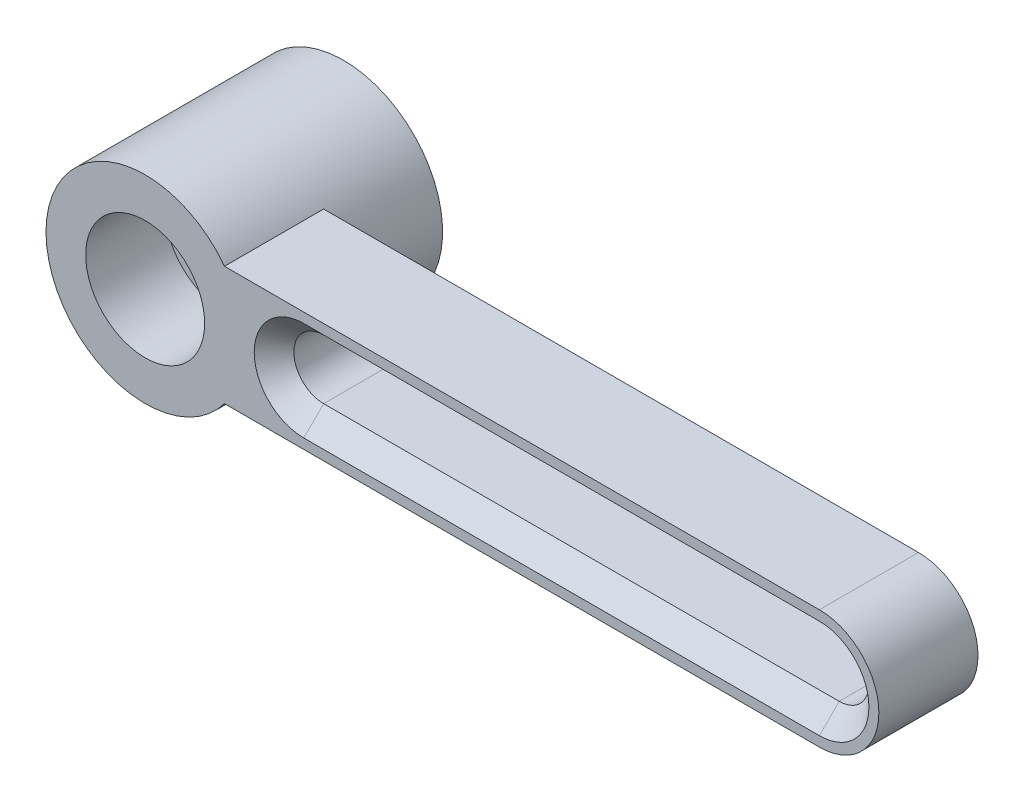
ISO-10303-21;
HEADER;
FILE_DESCRIPTION(('STEP AP214'),'2;1');
FILE_NAME('part.step','',(''),(''),'','','');
FILE_SCHEMA(('AUTOMOTIVE_DESIGN { 1 0 10303 214 1 1 1 1 }'));
ENDSEC;
DATA;
#1=APPLICATION_CONTEXT('core data for automotive mechanical design processes');
#2=APPLICATION_PROTOCOL_DEFINITION('international standard','automotive_design',2000,#1);
#3=PRODUCT_CONTEXT('',#1,'mechanical');
#4=PRODUCT('Part','Part','',(#3));
#5=PRODUCT_RELATED_PRODUCT_CATEGORY('part','',(#4));
#6=PRODUCT_DEFINITION_FORMATION('','',#4);
#7=PRODUCT_DEFINITION_CONTEXT('part definition',#1,'design');
#8=PRODUCT_DEFINITION('design','',#6,#7);
#9=PRODUCT_DEFINITION_SHAPE('','',#8);
#10=(LENGTH_UNIT() NAMED_UNIT(*) SI_UNIT(.MILLI.,.METRE.));
#11=(NAMED_UNIT(*) PLANE_ANGLE_UNIT() SI_UNIT($,.RADIAN.));
#12=(NAMED_UNIT(*) SI_UNIT($,.STERADIAN.) SOLID_ANGLE_UNIT());
#13=UNCERTAINTY_MEASURE_WITH_UNIT(LENGTH_MEASURE(1.E-05),#10,'distance_accuracy_value','');
#14=(GEOMETRIC_REPRESENTATION_CONTEXT(3) GLOBAL_UNCERTAINTY_ASSIGNED_CONTEXT((#13)) GLOBAL_UNIT_ASSIGNED_CONTEXT((#10,
#11,#12)) REPRESENTATION_CONTEXT('',''));
#15=CARTESIAN_POINT('',(0.,0.,0.));
#16=DIRECTION('',(0.,0.,1.));
#17=DIRECTION('',(1.,0.,0.));
#18=AXIS2_PLACEMENT_3D('',#15,#16,#17);
#19=CARTESIAN_POINT('',(-17.,0.,-5.));
#20=DIRECTION('',(0.,0.,1.));
#21=DIRECTION('',(1.,0.,0.));
#22=AXIS2_PLACEMENT_3D('',#19,#20,#21);
#23=CYLINDRICAL_SURFACE('',#22,1.6);
#24=CARTESIAN_POINT('',(-17.,0.,-5.));
#25=DIRECTION('',(0.,0.,1.));
#26=DIRECTION('',(1.,0.,0.));
#27=AXIS2_PLACEMENT_3D('',#24,#25,#26);
#28=CIRCLE('',#27,1.6);
#29=CARTESIAN_POINT('',(-15.4,0.,-5.));
#30=VERTEX_POINT('',#29);
#31=EDGE_CURVE('E145',#30,#30,#28,.T.);
#32=ORIENTED_EDGE('',*,*,#31,.F.);
#33=EDGE_LOOP('',(#32));
#34=FACE_BOUND('',#33,.T.);
#35=CARTESIAN_POINT('',(-17.,0.,1.));
#36=DIRECTION('',(0.,0.,1.));
#37=DIRECTION('',(1.,0.,0.));
#38=AXIS2_PLACEMENT_3D('',#35,#36,#37);
#39=CIRCLE('',#38,1.6);
#40=CARTESIAN_POINT('',(-15.4,0.,1.));
#41=VERTEX_POINT('',#40);
#42=EDGE_CURVE('E41',#41,#41,#39,.F.);
#43=ORIENTED_EDGE('',*,*,#42,.F.);
#44=EDGE_LOOP('',(#43));
#45=FACE_BOUND('',#44,.T.);
#46=ADVANCED_FACE('F37',(#34,#45),#23,.F.);
#47=CARTESIAN_POINT('',(17.,0.,5.));
#48=DIRECTION('',(0.,0.,-1.));
#49=DIRECTION('',(-1.,0.,0.));
#50=AXIS2_PLACEMENT_3D('',#47,#48,#49);
#51=CYLINDRICAL_SURFACE('',#50,3.);
#52=DIRECTION('',(0.,0.,-1.));
#53=VECTOR('',#52,1.);
#54=CARTESIAN_POINT('',(17.,3.,5.));
#55=LINE('',#54,#53);
#56=CARTESIAN_POINT('',(17.,3.,5.));
#57=VERTEX_POINT('',#56);
#58=CARTESIAN_POINT('',(17.,3.,0.));
#59=VERTEX_POINT('',#58);
#60=EDGE_CURVE('E154',#57,#59,#55,.T.);
#61=ORIENTED_EDGE('',*,*,#60,.F.);
#62=CARTESIAN_POINT('',(17.,0.,5.));
#63=DIRECTION('',(0.,0.,1.));
#64=DIRECTION('',(1.,0.,0.));
#65=AXIS2_PLACEMENT_3D('',#62,#63,#64);
#66=CIRCLE('',#65,3.);
#67=CARTESIAN_POINT('',(17.,-3.,5.));
#68=VERTEX_POINT('',#67);
#69=EDGE_CURVE('E149',#68,#57,#66,.T.);
#70=ORIENTED_EDGE('',*,*,#69,.F.);
#71=DIRECTION('',(0.,0.,-1.));
#72=VECTOR('',#71,1.);
#73=CARTESIAN_POINT('',(17.,-3.,5.));
#74=LINE('',#73,#72);
#75=CARTESIAN_POINT('',(17.,-3.,0.));
#76=VERTEX_POINT('',#75);
#77=EDGE_CURVE('E164',#76,#68,#74,.F.);
#78=ORIENTED_EDGE('',*,*,#77,.F.);
#79=CARTESIAN_POINT('',(17.,0.,0.));
#80=DIRECTION('',(0.,0.,1.));
#81=DIRECTION('',(1.,0.,0.));
#82=AXIS2_PLACEMENT_3D('',#79,#80,#81);
#83=CIRCLE('',#82,3.);
#84=EDGE_CURVE('E168',#59,#76,#83,.F.);
#85=ORIENTED_EDGE('',*,*,#84,.F.);
#86=EDGE_LOOP('',(#61,#70,#78,#85));
#87=FACE_BOUND('',#86,.T.);
#88=ADVANCED_FACE('F239',(#87),#51,.T.);
#89=CARTESIAN_POINT('',(0.,0.,5.));
#90=DIRECTION('',(0.,0.,1.));
#91=DIRECTION('',(1.,0.,0.));
#92=AXIS2_PLACEMENT_3D('',#89,#90,#91);
#93=PLANE('',#92);
#94=CARTESIAN_POINT('',(-17.,0.,5.));
#95=DIRECTION('',(0.,0.,1.));
#96=DIRECTION('',(1.,0.,0.));
#97=AXIS2_PLACEMENT_3D('',#94,#95,#96);
#98=CIRCLE('',#97,3.);
#99=CARTESIAN_POINT('',(-14.,0.,5.));
#100=VERTEX_POINT('',#99);
#101=EDGE_CURVE('E422',#100,#100,#98,.T.);
#102=ORIENTED_EDGE('',*,*,#101,.F.);
#103=EDGE_LOOP('',(#102));
#104=FACE_BOUND('',#103,.T.);
#105=DIRECTION('',(-1.,0.,0.));
#106=VECTOR('',#105,1.);
#107=CARTESIAN_POINT('',(-20.,3.,5.));
#108=LINE('',#107,#106);
#109=CARTESIAN_POINT('',(-13.,3.,5.));
#110=VERTEX_POINT('',#109);
#111=EDGE_CURVE('E142',#57,#110,#108,.T.);
#112=ORIENTED_EDGE('',*,*,#111,.T.);
#113=CARTESIAN_POINT('',(-17.,0.,5.));
#114=DIRECTION('',(0.,0.,-1.));
#115=DIRECTION('',(-1.,0.,0.));
#116=AXIS2_PLACEMENT_3D('',#113,#114,#115);
#117=CIRCLE('',#116,5.);
#118=CARTESIAN_POINT('',(-13.,-3.,5.));
#119=VERTEX_POINT('',#118);
#120=EDGE_CURVE('E126',#119,#110,#117,.T.);
#121=ORIENTED_EDGE('',*,*,#120,.F.);
#122=DIRECTION('',(1.,0.,0.));
#123=VECTOR('',#122,1.);
#124=CARTESIAN_POINT('',(-20.,-3.,5.));
#125=LINE('',#124,#123);
#126=EDGE_CURVE('E151',#119,#68,#125,.T.);
#127=ORIENTED_EDGE('',*,*,#126,.T.);
#128=ORIENTED_EDGE('',*,*,#69,.T.);
#129=EDGE_LOOP('',(#112,#121,#127,#128));
#130=FACE_BOUND('',#129,.T.);
#131=DIRECTION('',(-1.,0.,0.));
#132=VECTOR('',#131,1.);
#133=CARTESIAN_POINT('',(-9.00000000000001,-2.5,5.));
#134=LINE('',#133,#132);
#135=CARTESIAN_POINT('',(17.,-2.49999999999999,5.));
#136=VERTEX_POINT('',#135);
#137=CARTESIAN_POINT('',(-9.00000000000001,-2.5,5.));
#138=VERTEX_POINT('',#137);
#139=EDGE_CURVE('E53',#136,#138,#134,.T.);
#140=ORIENTED_EDGE('',*,*,#139,.T.);
#141=CARTESIAN_POINT('',(-9.00000000000001,0.,5.));
#142=DIRECTION('',(0.,0.,1.));
#143=DIRECTION('',(1.,0.,0.));
#144=AXIS2_PLACEMENT_3D('',#141,#142,#143);
#145=CIRCLE('',#144,2.5);
#146=CARTESIAN_POINT('',(-9.00000000000001,2.5,5.));
#147=VERTEX_POINT('',#146);
#148=EDGE_CURVE('E46',#138,#147,#145,.F.);
#149=ORIENTED_EDGE('',*,*,#148,.T.);
#150=DIRECTION('',(1.,0.,0.));
#151=VECTOR('',#150,1.);
#152=CARTESIAN_POINT('',(0.,2.5,5.));
#153=LINE('',#152,#151);
#154=CARTESIAN_POINT('',(17.,2.5,5.));
#155=VERTEX_POINT('',#154);
#156=EDGE_CURVE('E198',#147,#155,#153,.T.);
#157=ORIENTED_EDGE('',*,*,#156,.T.);
#158=CARTESIAN_POINT('',(17.,0.,5.));
#159=DIRECTION('',(0.,0.,1.));
#160=DIRECTION('',(1.,0.,0.));
#161=AXIS2_PLACEMENT_3D('',#158,#159,#160);
#162=CIRCLE('',#161,2.5);
#163=EDGE_CURVE('E58',#155,#136,#162,.F.);
#164=ORIENTED_EDGE('',*,*,#163,.T.);
#165=EDGE_LOOP('',(#140,#149,#157,#164));
#166=FACE_BOUND('',#165,.T.);
#167=ADVANCED_FACE('F147',(#104,#130,#166),#93,.T.);
#168=CARTESIAN_POINT('',(0.,0.,0.));
#169=DIRECTION('',(0.,0.,1.));
#170=DIRECTION('',(1.,0.,0.));
#171=AXIS2_PLACEMENT_3D('',#168,#169,#170);
#172=PLANE('',#171);
#173=DIRECTION('',(1.,0.,0.));
#174=VECTOR('',#173,1.);
#175=CARTESIAN_POINT('',(0.,-2.5,0.));
#176=LINE('',#175,#174);
#177=CARTESIAN_POINT('',(-9.00000000000001,-2.5,0.));
#178=VERTEX_POINT('',#177);
#179=CARTESIAN_POINT('',(17.,-2.5,0.));
#180=VERTEX_POINT('',#179);
#181=EDGE_CURVE('E173',#178,#180,#176,.T.);
#182=ORIENTED_EDGE('',*,*,#181,.T.);
#183=CARTESIAN_POINT('',(17.,0.,0.));
#184=DIRECTION('',(0.,0.,1.));
#185=DIRECTION('',(1.,0.,0.));
#186=AXIS2_PLACEMENT_3D('',#183,#184,#185);
#187=CIRCLE('',#186,2.5);
#188=CARTESIAN_POINT('',(17.,2.50000000000001,0.));
#189=VERTEX_POINT('',#188);
#190=EDGE_CURVE('E177',#180,#189,#187,.T.);
#191=ORIENTED_EDGE('',*,*,#190,.T.);
#192=DIRECTION('',(-1.,0.,0.));
#193=VECTOR('',#192,1.);
#194=CARTESIAN_POINT('',(-9.00000000000001,2.5,0.));
#195=LINE('',#194,#193);
#196=CARTESIAN_POINT('',(-9.00000000000001,2.5,0.));
#197=VERTEX_POINT('',#196);
#198=EDGE_CURVE('E175',#189,#197,#195,.T.);
#199=ORIENTED_EDGE('',*,*,#198,.T.);
#200=CARTESIAN_POINT('',(-9.00000000000001,0.,0.));
#201=DIRECTION('',(0.,0.,1.));
#202=DIRECTION('',(1.,0.,0.));
#203=AXIS2_PLACEMENT_3D('',#200,#201,#202);
#204=CIRCLE('',#203,2.5);
#205=EDGE_CURVE('E171',#197,#178,#204,.T.);
#206=ORIENTED_EDGE('',*,*,#205,.T.);
#207=EDGE_LOOP('',(#182,#191,#199,#206));
#208=FACE_BOUND('',#207,.T.);
#209=DIRECTION('',(1.,0.,0.));
#210=VECTOR('',#209,1.);
#211=CARTESIAN_POINT('',(-20.,-3.,0.));
#212=LINE('',#211,#210);
#213=CARTESIAN_POINT('',(-13.,-3.,0.));
#214=VERTEX_POINT('',#213);
#215=EDGE_CURVE('E152',#214,#76,#212,.T.);
#216=ORIENTED_EDGE('',*,*,#215,.F.);
#217=CARTESIAN_POINT('',(-17.,0.,0.));
#218=DIRECTION('',(0.,0.,1.));
#219=DIRECTION('',(1.,0.,0.));
#220=AXIS2_PLACEMENT_3D('',#217,#218,#219);
#221=CIRCLE('',#220,5.);
#222=CARTESIAN_POINT('',(-13.,3.,0.));
#223=VERTEX_POINT('',#222);
#224=EDGE_CURVE('E134',#214,#223,#221,.T.);
#225=ORIENTED_EDGE('',*,*,#224,.T.);
#226=DIRECTION('',(-1.,0.,0.));
#227=VECTOR('',#226,1.);
#228=CARTESIAN_POINT('',(-20.,3.,0.));
#229=LINE('',#228,#227);
#230=EDGE_CURVE('E144',#59,#223,#229,.T.);
#231=ORIENTED_EDGE('',*,*,#230,.F.);
#232=ORIENTED_EDGE('',*,*,#84,.T.);
#233=EDGE_LOOP('',(#216,#225,#231,#232));
#234=FACE_BOUND('',#233,.T.);
#235=ADVANCED_FACE('F238',(#208,#234),#172,.F.);
#236=CARTESIAN_POINT('',(-20.,3.,5.));
#237=DIRECTION('',(0.,-1.,0.));
#238=DIRECTION('',(0.,0.,-1.));
#239=AXIS2_PLACEMENT_3D('',#236,#237,#238);
#240=PLANE('',#239);
#241=ORIENTED_EDGE('',*,*,#230,.T.);
#242=DIRECTION('',(0.,0.,-1.));
#243=VECTOR('',#242,1.);
#244=CARTESIAN_POINT('',(-13.,3.,5.));
#245=LINE('',#244,#243);
#246=EDGE_CURVE('E129',#223,#110,#245,.F.);
#247=ORIENTED_EDGE('',*,*,#246,.T.);
#248=ORIENTED_EDGE('',*,*,#111,.F.);
#249=ORIENTED_EDGE('',*,*,#60,.T.);
#250=EDGE_LOOP('',(#241,#247,#248,#249));
#251=FACE_BOUND('',#250,.T.);
#252=ADVANCED_FACE('F140',(#251),#240,.F.);
#253=CARTESIAN_POINT('',(-20.,-3.,5.));
#254=DIRECTION('',(0.,1.,0.));
#255=DIRECTION('',(0.,0.,1.));
#256=AXIS2_PLACEMENT_3D('',#253,#254,#255);
#257=PLANE('',#256);
#258=ORIENTED_EDGE('',*,*,#126,.F.);
#259=DIRECTION('',(0.,0.,-1.));
#260=VECTOR('',#259,1.);
#261=CARTESIAN_POINT('',(-13.,-3.,5.));
#262=LINE('',#261,#260);
#263=EDGE_CURVE('E11',#119,#214,#262,.T.);
#264=ORIENTED_EDGE('',*,*,#263,.T.);
#265=ORIENTED_EDGE('',*,*,#215,.T.);
#266=ORIENTED_EDGE('',*,*,#77,.T.);
#267=EDGE_LOOP('',(#258,#264,#265,#266));
#268=FACE_BOUND('',#267,.T.);
#269=ADVANCED_FACE('F279',(#268),#257,.F.);
#270=CARTESIAN_POINT('',(-9.00000000000001,0.,-5.));
#271=DIRECTION('',(0.,0.,1.));
#272=DIRECTION('',(1.,0.,0.));
#273=AXIS2_PLACEMENT_3D('',#270,#271,#272);
#274=CYLINDRICAL_SURFACE('',#273,1.5);
#275=DIRECTION('',(0.,0.,1.));
#276=VECTOR('',#275,1.);
#277=CARTESIAN_POINT('',(-9.00000000000001,-1.5,-5.));
#278=LINE('',#277,#276);
#279=CARTESIAN_POINT('',(-9.00000000000001,-1.5,1.));
#280=VERTEX_POINT('',#279);
#281=CARTESIAN_POINT('',(-9.00000000000001,-1.5,4.));
#282=VERTEX_POINT('',#281);
#283=EDGE_CURVE('E158',#280,#282,#278,.T.);
#284=ORIENTED_EDGE('',*,*,#283,.F.);
#285=CARTESIAN_POINT('',(-9.00000000000001,0.,1.));
#286=DIRECTION('',(0.,0.,1.));
#287=DIRECTION('',(1.,0.,0.));
#288=AXIS2_PLACEMENT_3D('',#285,#286,#287);
#289=CIRCLE('',#288,1.5);
#290=CARTESIAN_POINT('',(-9.00000000000001,1.5,1.));
#291=VERTEX_POINT('',#290);
#292=EDGE_CURVE('E196',#280,#291,#289,.F.);
#293=ORIENTED_EDGE('',*,*,#292,.T.);
#294=DIRECTION('',(0.,0.,1.));
#295=VECTOR('',#294,1.);
#296=CARTESIAN_POINT('',(-9.00000000000001,1.5,-5.));
#297=LINE('',#296,#295);
#298=CARTESIAN_POINT('',(-9.00000000000001,1.5,4.));
#299=VERTEX_POINT('',#298);
#300=EDGE_CURVE('E161',#291,#299,#297,.T.);
#301=ORIENTED_EDGE('',*,*,#300,.T.);
#302=CARTESIAN_POINT('',(-9.00000000000001,0.,4.));
#303=DIRECTION('',(0.,0.,1.));
#304=DIRECTION('',(1.,0.,0.));
#305=AXIS2_PLACEMENT_3D('',#302,#303,#304);
#306=CIRCLE('',#305,1.5);
#307=EDGE_CURVE('E193',#299,#282,#306,.T.);
#308=ORIENTED_EDGE('',*,*,#307,.T.);
#309=EDGE_LOOP('',(#284,#293,#301,#308));
#310=FACE_BOUND('',#309,.T.);
#311=ADVANCED_FACE('F268',(#310),#274,.F.);
#312=CARTESIAN_POINT('',(0.,1.5,-5.));
#313=DIRECTION('',(0.,-1.,0.));
#314=DIRECTION('',(1.,0.,0.));
#315=AXIS2_PLACEMENT_3D('',#312,#313,#314);
#316=PLANE('',#315);
#317=ORIENTED_EDGE('',*,*,#300,.F.);
#318=DIRECTION('',(1.,0.,0.));
#319=VECTOR('',#318,1.);
#320=CARTESIAN_POINT('',(17.,1.5,1.));
#321=LINE('',#320,#319);
#322=CARTESIAN_POINT('',(17.,1.5,1.));
#323=VERTEX_POINT('',#322);
#324=EDGE_CURVE('E187',#291,#323,#321,.T.);
#325=ORIENTED_EDGE('',*,*,#324,.T.);
#326=DIRECTION('',(0.,0.,1.));
#327=VECTOR('',#326,1.);
#328=CARTESIAN_POINT('',(17.,1.5,-5.));
#329=LINE('',#328,#327);
#330=CARTESIAN_POINT('',(17.,1.5,4.));
#331=VERTEX_POINT('',#330);
#332=EDGE_CURVE('E302',#323,#331,#329,.T.);
#333=ORIENTED_EDGE('',*,*,#332,.T.);
#334=DIRECTION('',(-1.,0.,0.));
#335=VECTOR('',#334,1.);
#336=CARTESIAN_POINT('',(0.,1.5,4.));
#337=LINE('',#336,#335);
#338=EDGE_CURVE('E185',#331,#299,#337,.T.);
#339=ORIENTED_EDGE('',*,*,#338,.T.);
#340=EDGE_LOOP('',(#317,#325,#333,#339));
#341=FACE_BOUND('',#340,.T.);
#342=ADVANCED_FACE('F264',(#341),#316,.T.);
#343=CARTESIAN_POINT('',(17.,0.,-5.));
#344=DIRECTION('',(0.,0.,1.));
#345=DIRECTION('',(1.,0.,0.));
#346=AXIS2_PLACEMENT_3D('',#343,#344,#345);
#347=CYLINDRICAL_SURFACE('',#346,1.5);
#348=ORIENTED_EDGE('',*,*,#332,.F.);
#349=CARTESIAN_POINT('',(17.,0.,1.));
#350=DIRECTION('',(0.,0.,1.));
#351=DIRECTION('',(1.,0.,0.));
#352=AXIS2_PLACEMENT_3D('',#349,#350,#351);
#353=CIRCLE('',#352,1.5);
#354=CARTESIAN_POINT('',(17.,-1.5,1.));
#355=VERTEX_POINT('',#354);
#356=EDGE_CURVE('E182',#323,#355,#353,.F.);
#357=ORIENTED_EDGE('',*,*,#356,.T.);
#358=DIRECTION('',(0.,0.,1.));
#359=VECTOR('',#358,1.);
#360=CARTESIAN_POINT('',(17.,-1.5,-5.));
#361=LINE('',#360,#359);
#362=CARTESIAN_POINT('',(17.,-1.5,4.));
#363=VERTEX_POINT('',#362);
#364=EDGE_CURVE('E304',#355,#363,#361,.T.);
#365=ORIENTED_EDGE('',*,*,#364,.T.);
#366=CARTESIAN_POINT('',(17.,0.,4.));
#367=DIRECTION('',(0.,0.,1.));
#368=DIRECTION('',(1.,0.,0.));
#369=AXIS2_PLACEMENT_3D('',#366,#367,#368);
#370=CIRCLE('',#369,1.5);
#371=EDGE_CURVE('E180',#363,#331,#370,.T.);
#372=ORIENTED_EDGE('',*,*,#371,.T.);
#373=EDGE_LOOP('',(#348,#357,#365,#372));
#374=FACE_BOUND('',#373,.T.);
#375=ADVANCED_FACE('F267',(#374),#347,.F.);
#376=CARTESIAN_POINT('',(0.,-1.5,-5.));
#377=DIRECTION('',(0.,-1.,0.));
#378=DIRECTION('',(1.,0.,0.));
#379=AXIS2_PLACEMENT_3D('',#376,#377,#378);
#380=PLANE('',#379);
#381=ORIENTED_EDGE('',*,*,#364,.F.);
#382=DIRECTION('',(-1.,0.,0.));
#383=VECTOR('',#382,1.);
#384=CARTESIAN_POINT('',(0.,-1.5,1.));
#385=LINE('',#384,#383);
#386=EDGE_CURVE('E191',#355,#280,#385,.T.);
#387=ORIENTED_EDGE('',*,*,#386,.T.);
#388=ORIENTED_EDGE('',*,*,#283,.T.);
#389=DIRECTION('',(1.,0.,0.));
#390=VECTOR('',#389,1.);
#391=CARTESIAN_POINT('',(17.,-1.5,4.));
#392=LINE('',#391,#390);
#393=EDGE_CURVE('E189',#282,#363,#392,.T.);
#394=ORIENTED_EDGE('',*,*,#393,.T.);
#395=EDGE_LOOP('',(#381,#387,#388,#394));
#396=FACE_BOUND('',#395,.T.);
#397=ADVANCED_FACE('F272',(#396),#380,.F.);
#398=CARTESIAN_POINT('',(-9.00000000000001,0.,0.));
#399=DIRECTION('',(0.,0.,-1.));
#400=DIRECTION('',(-1.,0.,0.));
#401=AXIS2_PLACEMENT_3D('',#398,#399,#400);
#402=CONICAL_SURFACE('',#401,2.5,0.785398163397447);
#403=DIRECTION('',(0.,0.707106781186547,-0.707106781186549));
#404=VECTOR('',#403,1.);
#405=CARTESIAN_POINT('',(-9.00000000000001,1.5,1.));
#406=LINE('',#405,#404);
#407=EDGE_CURVE('E208',#291,#197,#406,.T.);
#408=ORIENTED_EDGE('',*,*,#407,.F.);
#409=ORIENTED_EDGE('',*,*,#292,.F.);
#410=DIRECTION('',(0.,0.707106781186546,0.707106781186549));
#411=VECTOR('',#410,1.);
#412=CARTESIAN_POINT('',(-9.00000000000001,-2.5,0.));
#413=LINE('',#412,#411);
#414=EDGE_CURVE('E211',#178,#280,#413,.T.);
#415=ORIENTED_EDGE('',*,*,#414,.F.);
#416=ORIENTED_EDGE('',*,*,#205,.F.);
#417=EDGE_LOOP('',(#408,#409,#415,#416));
#418=FACE_BOUND('',#417,.T.);
#419=ADVANCED_FACE('F276',(#418),#402,.F.);
#420=CARTESIAN_POINT('',(0.,-2.5,0.));
#421=DIRECTION('',(0.,-0.707106781186549,0.707106781186547));
#422=DIRECTION('',(1.,0.,0.));
#423=AXIS2_PLACEMENT_3D('',#420,#421,#422);
#424=PLANE('',#423);
#425=ORIENTED_EDGE('',*,*,#414,.T.);
#426=ORIENTED_EDGE('',*,*,#386,.F.);
#427=DIRECTION('',(0.,0.707106781186547,0.707106781186549));
#428=VECTOR('',#427,1.);
#429=CARTESIAN_POINT('',(17.,-2.5,0.));
#430=LINE('',#429,#428);
#431=EDGE_CURVE('E205',#180,#355,#430,.T.);
#432=ORIENTED_EDGE('',*,*,#431,.F.);
#433=ORIENTED_EDGE('',*,*,#181,.F.);
#434=EDGE_LOOP('',(#425,#426,#432,#433));
#435=FACE_BOUND('',#434,.T.);
#436=ADVANCED_FACE('F319',(#435),#424,.F.);
#437=CARTESIAN_POINT('',(0.,1.5,1.));
#438=DIRECTION('',(0.,-0.707106781186549,-0.707106781186547));
#439=DIRECTION('',(-1.,0.,0.));
#440=AXIS2_PLACEMENT_3D('',#437,#438,#439);
#441=PLANE('',#440);
#442=ORIENTED_EDGE('',*,*,#407,.T.);
#443=ORIENTED_EDGE('',*,*,#198,.F.);
#444=DIRECTION('',(0.,0.707106781186547,-0.707106781186548));
#445=VECTOR('',#444,1.);
#446=CARTESIAN_POINT('',(17.,1.5,1.));
#447=LINE('',#446,#445);
#448=EDGE_CURVE('E203',#323,#189,#447,.T.);
#449=ORIENTED_EDGE('',*,*,#448,.F.);
#450=ORIENTED_EDGE('',*,*,#324,.F.);
#451=EDGE_LOOP('',(#442,#443,#449,#450));
#452=FACE_BOUND('',#451,.T.);
#453=ADVANCED_FACE('F325',(#452),#441,.T.);
#454=CARTESIAN_POINT('',(17.,0.,0.));
#455=DIRECTION('',(0.,0.,-1.));
#456=DIRECTION('',(-1.,0.,0.));
#457=AXIS2_PLACEMENT_3D('',#454,#455,#456);
#458=CONICAL_SURFACE('',#457,2.5,0.785398163397447);
#459=ORIENTED_EDGE('',*,*,#431,.T.);
#460=ORIENTED_EDGE('',*,*,#356,.F.);
#461=ORIENTED_EDGE('',*,*,#448,.T.);
#462=ORIENTED_EDGE('',*,*,#190,.F.);
#463=EDGE_LOOP('',(#459,#460,#461,#462));
#464=FACE_BOUND('',#463,.T.);
#465=ADVANCED_FACE('F330',(#464),#458,.F.);
#466=CARTESIAN_POINT('',(17.,0.,4.));
#467=DIRECTION('',(0.,0.,1.));
#468=DIRECTION('',(1.,0.,0.));
#469=AXIS2_PLACEMENT_3D('',#466,#467,#468);
#470=CONICAL_SURFACE('',#469,1.5,0.785398163397447);
#471=DIRECTION('',(0.,0.707106781186546,-0.707106781186549));
#472=VECTOR('',#471,1.);
#473=CARTESIAN_POINT('',(17.,-2.49999999999999,5.));
#474=LINE('',#473,#472);
#475=EDGE_CURVE('E218',#136,#363,#474,.T.);
#476=ORIENTED_EDGE('',*,*,#475,.F.);
#477=ORIENTED_EDGE('',*,*,#163,.F.);
#478=DIRECTION('',(0.,0.707106781186546,0.707106781186549));
#479=VECTOR('',#478,1.);
#480=CARTESIAN_POINT('',(17.,1.5,4.));
#481=LINE('',#480,#479);
#482=EDGE_CURVE('E206',#331,#155,#481,.T.);
#483=ORIENTED_EDGE('',*,*,#482,.F.);
#484=ORIENTED_EDGE('',*,*,#371,.F.);
#485=EDGE_LOOP('',(#476,#477,#483,#484));
#486=FACE_BOUND('',#485,.T.);
#487=ADVANCED_FACE('F39',(#486),#470,.F.);
#488=CARTESIAN_POINT('',(0.,2.5,5.));
#489=DIRECTION('',(0.,0.707106781186549,-0.707106781186546));
#490=DIRECTION('',(1.,0.,0.));
#491=AXIS2_PLACEMENT_3D('',#488,#489,#490);
#492=PLANE('',#491);
#493=ORIENTED_EDGE('',*,*,#482,.T.);
#494=ORIENTED_EDGE('',*,*,#156,.F.);
#495=DIRECTION('',(0.,0.707106781186546,0.707106781186549));
#496=VECTOR('',#495,1.);
#497=CARTESIAN_POINT('',(-9.00000000000001,1.5,4.));
#498=LINE('',#497,#496);
#499=EDGE_CURVE('E216',#299,#147,#498,.T.);
#500=ORIENTED_EDGE('',*,*,#499,.F.);
#501=ORIENTED_EDGE('',*,*,#338,.F.);
#502=EDGE_LOOP('',(#493,#494,#500,#501));
#503=FACE_BOUND('',#502,.T.);
#504=ADVANCED_FACE('F226',(#503),#492,.F.);
#505=CARTESIAN_POINT('',(0.,-1.5,4.));
#506=DIRECTION('',(0.,0.707106781186549,0.707106781186546));
#507=DIRECTION('',(-1.,0.,0.));
#508=AXIS2_PLACEMENT_3D('',#505,#506,#507);
#509=PLANE('',#508);
#510=ORIENTED_EDGE('',*,*,#475,.T.);
#511=ORIENTED_EDGE('',*,*,#393,.F.);
#512=DIRECTION('',(0.,0.707106781186546,-0.707106781186549));
#513=VECTOR('',#512,1.);
#514=CARTESIAN_POINT('',(-9.00000000000001,-2.5,5.));
#515=LINE('',#514,#513);
#516=EDGE_CURVE('E214',#138,#282,#515,.T.);
#517=ORIENTED_EDGE('',*,*,#516,.F.);
#518=ORIENTED_EDGE('',*,*,#139,.F.);
#519=EDGE_LOOP('',(#510,#511,#517,#518));
#520=FACE_BOUND('',#519,.T.);
#521=ADVANCED_FACE('F233',(#520),#509,.T.);
#522=CARTESIAN_POINT('',(-9.00000000000001,0.,4.));
#523=DIRECTION('',(0.,0.,1.));
#524=DIRECTION('',(1.,0.,0.));
#525=AXIS2_PLACEMENT_3D('',#522,#523,#524);
#526=CONICAL_SURFACE('',#525,1.5,0.785398163397447);
#527=ORIENTED_EDGE('',*,*,#499,.T.);
#528=ORIENTED_EDGE('',*,*,#148,.F.);
#529=ORIENTED_EDGE('',*,*,#516,.T.);
#530=ORIENTED_EDGE('',*,*,#307,.F.);
#531=EDGE_LOOP('',(#527,#528,#529,#530));
#532=FACE_BOUND('',#531,.T.);
#533=ADVANCED_FACE('F236',(#532),#526,.F.);
#534=CARTESIAN_POINT('',(-17.,0.,-5.));
#535=DIRECTION('',(0.,0.,-1.));
#536=DIRECTION('',(-1.,0.,0.));
#537=AXIS2_PLACEMENT_3D('',#534,#535,#536);
#538=PLANE('',#537);
#539=ORIENTED_EDGE('',*,*,#31,.T.);
#540=EDGE_LOOP('',(#539));
#541=FACE_BOUND('',#540,.T.);
#542=CARTESIAN_POINT('',(-17.,0.,-5.));
#543=DIRECTION('',(0.,0.,-1.));
#544=DIRECTION('',(-1.,0.,0.));
#545=AXIS2_PLACEMENT_3D('',#542,#543,#544);
#546=CIRCLE('',#545,5.);
#547=CARTESIAN_POINT('',(-22.,0.,-5.));
#548=VERTEX_POINT('',#547);
#549=EDGE_CURVE('E135',#548,#548,#546,.T.);
#550=ORIENTED_EDGE('',*,*,#549,.T.);
#551=EDGE_LOOP('',(#550));
#552=FACE_BOUND('',#551,.T.);
#553=ADVANCED_FACE('F281',(#541,#552),#538,.T.);
#554=CARTESIAN_POINT('',(-17.,0.,5.));
#555=DIRECTION('',(0.,0.,-1.));
#556=DIRECTION('',(-1.,0.,0.));
#557=AXIS2_PLACEMENT_3D('',#554,#555,#556);
#558=CYLINDRICAL_SURFACE('',#557,5.);
#559=ORIENTED_EDGE('',*,*,#549,.F.);
#560=EDGE_LOOP('',(#559));
#561=FACE_BOUND('',#560,.T.);
#562=ORIENTED_EDGE('',*,*,#246,.F.);
#563=ORIENTED_EDGE('',*,*,#224,.F.);
#564=ORIENTED_EDGE('',*,*,#263,.F.);
#565=ORIENTED_EDGE('',*,*,#120,.T.);
#566=EDGE_LOOP('',(#562,#563,#564,#565));
#567=FACE_BOUND('',#566,.T.);
#568=ADVANCED_FACE('F128',(#561,#567),#558,.T.);
#569=CARTESIAN_POINT('',(-17.,0.,1.));
#570=DIRECTION('',(0.,0.,1.));
#571=DIRECTION('',(1.,0.,0.));
#572=AXIS2_PLACEMENT_3D('',#569,#570,#571);
#573=PLANE('',#572);
#574=CARTESIAN_POINT('',(-17.,0.,1.));
#575=DIRECTION('',(0.,0.,1.));
#576=DIRECTION('',(1.,0.,0.));
#577=AXIS2_PLACEMENT_3D('',#574,#575,#576);
#578=CIRCLE('',#577,3.);
#579=CARTESIAN_POINT('',(-14.,0.,1.));
#580=VERTEX_POINT('',#579);
#581=EDGE_CURVE('E295',#580,#580,#578,.T.);
#582=ORIENTED_EDGE('',*,*,#581,.T.);
#583=EDGE_LOOP('',(#582));
#584=FACE_BOUND('',#583,.T.);
#585=ORIENTED_EDGE('',*,*,#42,.T.);
#586=EDGE_LOOP('',(#585));
#587=FACE_BOUND('',#586,.T.);
#588=ADVANCED_FACE('F286',(#584,#587),#573,.T.);
#589=CARTESIAN_POINT('',(-17.,0.,1.));
#590=DIRECTION('',(0.,0.,1.));
#591=DIRECTION('',(1.,0.,0.));
#592=AXIS2_PLACEMENT_3D('',#589,#590,#591);
#593=CYLINDRICAL_SURFACE('',#592,3.);
#594=ORIENTED_EDGE('',*,*,#581,.F.);
#595=EDGE_LOOP('',(#594));
#596=FACE_BOUND('',#595,.T.);
#597=ORIENTED_EDGE('',*,*,#101,.T.);
#598=EDGE_LOOP('',(#597));
#599=FACE_BOUND('',#598,.T.);
#600=ADVANCED_FACE('F405',(#596,#599),#593,.F.);
#601=CLOSED_SHELL('',(#46,#88,#167,#235,#252,#269,#311,#342,#375,#397,#419,#436,#453,#465,#487,
#504,#521,#533,#553,#568,#588,#600));
#602=MANIFOLD_SOLID_BREP('B2',#601);
#603=ADVANCED_BREP_SHAPE_REPRESENTATION('',(#18,#602),#14);
#604=SHAPE_DEFINITION_REPRESENTATION(#9,#603);
ENDSEC;
END-ISO-10303-21;
